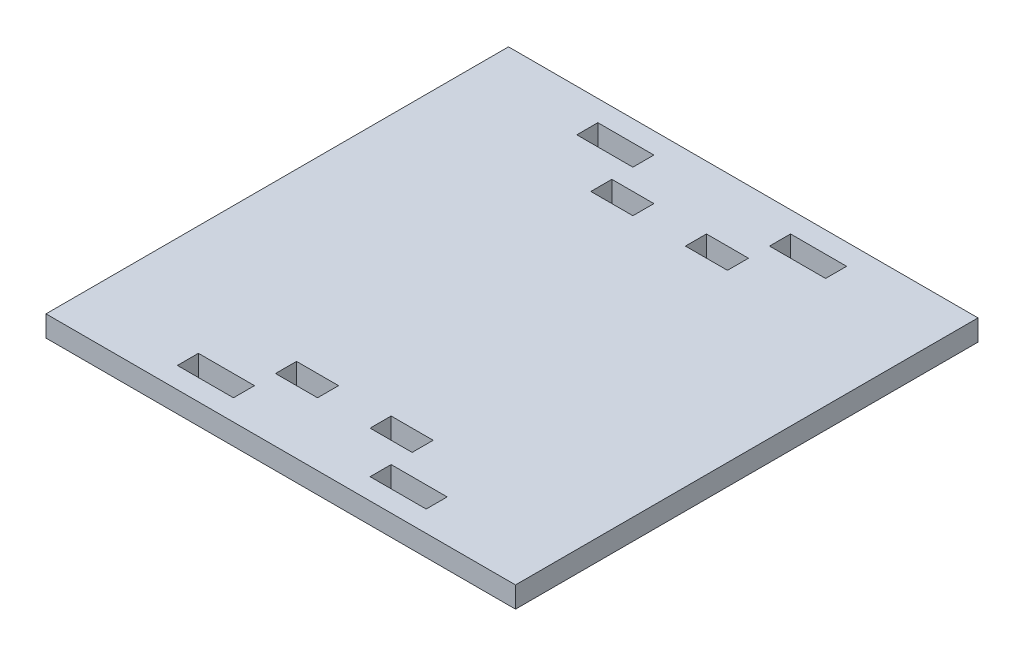
ISO-10303-21;
HEADER;
FILE_DESCRIPTION(('STEP AP214'),'2;1');
FILE_NAME('part.step','',(''),(''),'','','');
FILE_SCHEMA(('AUTOMOTIVE_DESIGN { 1 0 10303 214 1 1 1 1 }'));
ENDSEC;
DATA;
#1=APPLICATION_CONTEXT('core data for automotive mechanical design processes');
#2=APPLICATION_PROTOCOL_DEFINITION('international standard','automotive_design',2000,#1);
#3=PRODUCT_CONTEXT('',#1,'mechanical');
#4=PRODUCT('Part','Part','',(#3));
#5=PRODUCT_RELATED_PRODUCT_CATEGORY('part','',(#4));
#6=PRODUCT_DEFINITION_FORMATION('','',#4);
#7=PRODUCT_DEFINITION_CONTEXT('part definition',#1,'design');
#8=PRODUCT_DEFINITION('design','',#6,#7);
#9=PRODUCT_DEFINITION_SHAPE('','',#8);
#10=(LENGTH_UNIT() NAMED_UNIT(*) SI_UNIT(.MILLI.,.METRE.));
#11=(NAMED_UNIT(*) PLANE_ANGLE_UNIT() SI_UNIT($,.RADIAN.));
#12=(NAMED_UNIT(*) SI_UNIT($,.STERADIAN.) SOLID_ANGLE_UNIT());
#13=UNCERTAINTY_MEASURE_WITH_UNIT(LENGTH_MEASURE(1.E-05),#10,'distance_accuracy_value','');
#14=(GEOMETRIC_REPRESENTATION_CONTEXT(3) GLOBAL_UNCERTAINTY_ASSIGNED_CONTEXT((#13)) GLOBAL_UNIT_ASSIGNED_CONTEXT((#10,
#11,#12)) REPRESENTATION_CONTEXT('',''));
#15=CARTESIAN_POINT('',(0.,0.,0.));
#16=DIRECTION('',(0.,0.,1.));
#17=DIRECTION('',(1.,0.,0.));
#18=AXIS2_PLACEMENT_3D('',#15,#16,#17);
#19=CARTESIAN_POINT('',(0.,3.,-27.));
#20=DIRECTION('',(0.,0.,1.));
#21=DIRECTION('',(1.,0.,0.));
#22=AXIS2_PLACEMENT_3D('',#19,#20,#21);
#23=PLANE('',#22);
#24=DIRECTION('',(-1.,0.,0.));
#25=VECTOR('',#24,1.);
#26=CARTESIAN_POINT('',(0.,0.,-27.));
#27=LINE('',#26,#25);
#28=CARTESIAN_POINT('',(17.75,0.,-27.));
#29=VERTEX_POINT('',#28);
#30=CARTESIAN_POINT('',(9.75000000000001,0.,-27.));
#31=VERTEX_POINT('',#30);
#32=EDGE_CURVE('E386',#29,#31,#27,.T.);
#33=ORIENTED_EDGE('',*,*,#32,.T.);
#34=DIRECTION('',(0.,-1.,0.));
#35=VECTOR('',#34,1.);
#36=CARTESIAN_POINT('',(9.75000000000001,3.,-27.));
#37=LINE('',#36,#35);
#38=CARTESIAN_POINT('',(9.75000000000001,3.,-27.));
#39=VERTEX_POINT('',#38);
#40=EDGE_CURVE('E11',#39,#31,#37,.T.);
#41=ORIENTED_EDGE('',*,*,#40,.F.);
#42=DIRECTION('',(-1.,0.,0.));
#43=VECTOR('',#42,1.);
#44=CARTESIAN_POINT('',(0.,3.,-27.));
#45=LINE('',#44,#43);
#46=CARTESIAN_POINT('',(17.75,3.,-27.));
#47=VERTEX_POINT('',#46);
#48=EDGE_CURVE('E285',#47,#39,#45,.T.);
#49=ORIENTED_EDGE('',*,*,#48,.F.);
#50=DIRECTION('',(0.,-1.,0.));
#51=VECTOR('',#50,1.);
#52=CARTESIAN_POINT('',(17.75,3.,-27.));
#53=LINE('',#52,#51);
#54=EDGE_CURVE('E393',#47,#29,#53,.T.);
#55=ORIENTED_EDGE('',*,*,#54,.T.);
#56=EDGE_LOOP('',(#33,#41,#49,#55));
#57=FACE_BOUND('',#56,.T.);
#58=ADVANCED_FACE('F36',(#57),#23,.F.);
#59=CARTESIAN_POINT('',(9.75000000000001,3.,0.));
#60=DIRECTION('',(-1.,0.,0.));
#61=DIRECTION('',(0.,0.,1.));
#62=AXIS2_PLACEMENT_3D('',#59,#60,#61);
#63=PLANE('',#62);
#64=DIRECTION('',(0.,0.,-1.));
#65=VECTOR('',#64,1.);
#66=CARTESIAN_POINT('',(9.75000000000001,0.,0.));
#67=LINE('',#66,#65);
#68=CARTESIAN_POINT('',(9.75000000000001,0.,-30.));
#69=VERTEX_POINT('',#68);
#70=EDGE_CURVE('E290',#31,#69,#67,.T.);
#71=ORIENTED_EDGE('',*,*,#70,.T.);
#72=DIRECTION('',(0.,-1.,0.));
#73=VECTOR('',#72,1.);
#74=CARTESIAN_POINT('',(9.75000000000001,3.,-30.));
#75=LINE('',#74,#73);
#76=CARTESIAN_POINT('',(9.75000000000001,3.,-30.));
#77=VERTEX_POINT('',#76);
#78=EDGE_CURVE('E46',#77,#69,#75,.T.);
#79=ORIENTED_EDGE('',*,*,#78,.F.);
#80=DIRECTION('',(0.,0.,-1.));
#81=VECTOR('',#80,1.);
#82=CARTESIAN_POINT('',(9.75000000000001,3.,0.));
#83=LINE('',#82,#81);
#84=EDGE_CURVE('E279',#39,#77,#83,.T.);
#85=ORIENTED_EDGE('',*,*,#84,.F.);
#86=ORIENTED_EDGE('',*,*,#40,.T.);
#87=EDGE_LOOP('',(#71,#79,#85,#86));
#88=FACE_BOUND('',#87,.T.);
#89=ADVANCED_FACE('F289',(#88),#63,.F.);
#90=CARTESIAN_POINT('',(0.,3.,-30.));
#91=DIRECTION('',(0.,0.,-1.));
#92=DIRECTION('',(-1.,0.,0.));
#93=AXIS2_PLACEMENT_3D('',#90,#91,#92);
#94=PLANE('',#93);
#95=DIRECTION('',(1.,0.,0.));
#96=VECTOR('',#95,1.);
#97=CARTESIAN_POINT('',(0.,0.,-30.));
#98=LINE('',#97,#96);
#99=CARTESIAN_POINT('',(17.75,0.,-30.));
#100=VERTEX_POINT('',#99);
#101=EDGE_CURVE('E168',#69,#100,#98,.T.);
#102=ORIENTED_EDGE('',*,*,#101,.T.);
#103=DIRECTION('',(0.,-1.,0.));
#104=VECTOR('',#103,1.);
#105=CARTESIAN_POINT('',(17.75,3.,-30.));
#106=LINE('',#105,#104);
#107=CARTESIAN_POINT('',(17.75,3.,-30.));
#108=VERTEX_POINT('',#107);
#109=EDGE_CURVE('E291',#108,#100,#106,.T.);
#110=ORIENTED_EDGE('',*,*,#109,.F.);
#111=DIRECTION('',(1.,0.,0.));
#112=VECTOR('',#111,1.);
#113=CARTESIAN_POINT('',(0.,3.,-30.));
#114=LINE('',#113,#112);
#115=EDGE_CURVE('E283',#77,#108,#114,.T.);
#116=ORIENTED_EDGE('',*,*,#115,.F.);
#117=ORIENTED_EDGE('',*,*,#78,.T.);
#118=EDGE_LOOP('',(#102,#110,#116,#117));
#119=FACE_BOUND('',#118,.T.);
#120=ADVANCED_FACE('F293',(#119),#94,.F.);
#121=CARTESIAN_POINT('',(-9.75000000000001,3.,0.));
#122=DIRECTION('',(1.,0.,0.));
#123=DIRECTION('',(0.,0.,-1.));
#124=AXIS2_PLACEMENT_3D('',#121,#122,#123);
#125=PLANE('',#124);
#126=DIRECTION('',(0.,0.,1.));
#127=VECTOR('',#126,1.);
#128=CARTESIAN_POINT('',(-9.75000000000001,0.,0.));
#129=LINE('',#128,#127);
#130=CARTESIAN_POINT('',(-9.75000000000001,0.,27.));
#131=VERTEX_POINT('',#130);
#132=CARTESIAN_POINT('',(-9.75000000000001,0.,30.));
#133=VERTEX_POINT('',#132);
#134=EDGE_CURVE('E377',#131,#133,#129,.T.);
#135=ORIENTED_EDGE('',*,*,#134,.T.);
#136=DIRECTION('',(0.,-1.,0.));
#137=VECTOR('',#136,1.);
#138=CARTESIAN_POINT('',(-9.75000000000001,3.,30.));
#139=LINE('',#138,#137);
#140=CARTESIAN_POINT('',(-9.75000000000001,3.,30.));
#141=VERTEX_POINT('',#140);
#142=EDGE_CURVE('E395',#141,#133,#139,.T.);
#143=ORIENTED_EDGE('',*,*,#142,.F.);
#144=DIRECTION('',(0.,0.,1.));
#145=VECTOR('',#144,1.);
#146=CARTESIAN_POINT('',(-9.75000000000001,3.,0.));
#147=LINE('',#146,#145);
#148=CARTESIAN_POINT('',(-9.75000000000001,3.,27.));
#149=VERTEX_POINT('',#148);
#150=EDGE_CURVE('E558',#149,#141,#147,.T.);
#151=ORIENTED_EDGE('',*,*,#150,.F.);
#152=DIRECTION('',(0.,-1.,0.));
#153=VECTOR('',#152,1.);
#154=CARTESIAN_POINT('',(-9.75000000000001,3.,27.));
#155=LINE('',#154,#153);
#156=EDGE_CURVE('E397',#149,#131,#155,.T.);
#157=ORIENTED_EDGE('',*,*,#156,.T.);
#158=EDGE_LOOP('',(#135,#143,#151,#157));
#159=FACE_BOUND('',#158,.T.);
#160=ADVANCED_FACE('F578',(#159),#125,.F.);
#161=CARTESIAN_POINT('',(0.,3.,30.));
#162=DIRECTION('',(0.,0.,1.));
#163=DIRECTION('',(1.,0.,0.));
#164=AXIS2_PLACEMENT_3D('',#161,#162,#163);
#165=PLANE('',#164);
#166=DIRECTION('',(-1.,0.,0.));
#167=VECTOR('',#166,1.);
#168=CARTESIAN_POINT('',(0.,0.,30.));
#169=LINE('',#168,#167);
#170=CARTESIAN_POINT('',(-17.75,0.,30.));
#171=VERTEX_POINT('',#170);
#172=EDGE_CURVE('E380',#133,#171,#169,.T.);
#173=ORIENTED_EDGE('',*,*,#172,.T.);
#174=DIRECTION('',(0.,-1.,0.));
#175=VECTOR('',#174,1.);
#176=CARTESIAN_POINT('',(-17.75,3.,30.));
#177=LINE('',#176,#175);
#178=CARTESIAN_POINT('',(-17.75,3.,30.));
#179=VERTEX_POINT('',#178);
#180=EDGE_CURVE('E404',#179,#171,#177,.T.);
#181=ORIENTED_EDGE('',*,*,#180,.F.);
#182=DIRECTION('',(-1.,0.,0.));
#183=VECTOR('',#182,1.);
#184=CARTESIAN_POINT('',(0.,3.,30.));
#185=LINE('',#184,#183);
#186=EDGE_CURVE('E561',#141,#179,#185,.T.);
#187=ORIENTED_EDGE('',*,*,#186,.F.);
#188=ORIENTED_EDGE('',*,*,#142,.T.);
#189=EDGE_LOOP('',(#173,#181,#187,#188));
#190=FACE_BOUND('',#189,.T.);
#191=ADVANCED_FACE('F580',(#190),#165,.F.);
#192=CARTESIAN_POINT('',(-17.75,3.,0.));
#193=DIRECTION('',(-1.,0.,0.));
#194=DIRECTION('',(0.,0.,1.));
#195=AXIS2_PLACEMENT_3D('',#192,#193,#194);
#196=PLANE('',#195);
#197=DIRECTION('',(0.,0.,-1.));
#198=VECTOR('',#197,1.);
#199=CARTESIAN_POINT('',(-17.75,0.,0.));
#200=LINE('',#199,#198);
#201=CARTESIAN_POINT('',(-17.75,0.,27.));
#202=VERTEX_POINT('',#201);
#203=EDGE_CURVE('E382',#171,#202,#200,.T.);
#204=ORIENTED_EDGE('',*,*,#203,.T.);
#205=DIRECTION('',(0.,-1.,0.));
#206=VECTOR('',#205,1.);
#207=CARTESIAN_POINT('',(-17.75,3.,27.));
#208=LINE('',#207,#206);
#209=CARTESIAN_POINT('',(-17.75,3.,27.));
#210=VERTEX_POINT('',#209);
#211=EDGE_CURVE('E400',#210,#202,#208,.T.);
#212=ORIENTED_EDGE('',*,*,#211,.F.);
#213=DIRECTION('',(0.,0.,-1.));
#214=VECTOR('',#213,1.);
#215=CARTESIAN_POINT('',(-17.75,3.,0.));
#216=LINE('',#215,#214);
#217=EDGE_CURVE('E563',#179,#210,#216,.T.);
#218=ORIENTED_EDGE('',*,*,#217,.F.);
#219=ORIENTED_EDGE('',*,*,#180,.T.);
#220=EDGE_LOOP('',(#204,#212,#218,#219));
#221=FACE_BOUND('',#220,.T.);
#222=ADVANCED_FACE('F584',(#221),#196,.F.);
#223=CARTESIAN_POINT('',(3.75,3.,0.));
#224=DIRECTION('',(-1.,0.,0.));
#225=DIRECTION('',(0.,0.,1.));
#226=AXIS2_PLACEMENT_3D('',#223,#224,#225);
#227=PLANE('',#226);
#228=DIRECTION('',(0.,0.,-1.));
#229=VECTOR('',#228,1.);
#230=CARTESIAN_POINT('',(3.75,0.,0.));
#231=LINE('',#230,#229);
#232=CARTESIAN_POINT('',(3.75,0.,-21.));
#233=VERTEX_POINT('',#232);
#234=CARTESIAN_POINT('',(3.75,0.,-24.));
#235=VERTEX_POINT('',#234);
#236=EDGE_CURVE('E368',#233,#235,#231,.T.);
#237=ORIENTED_EDGE('',*,*,#236,.T.);
#238=DIRECTION('',(0.,-1.,0.));
#239=VECTOR('',#238,1.);
#240=CARTESIAN_POINT('',(3.75,3.,-24.));
#241=LINE('',#240,#239);
#242=CARTESIAN_POINT('',(3.75,3.,-24.));
#243=VERTEX_POINT('',#242);
#244=EDGE_CURVE('E401',#243,#235,#241,.T.);
#245=ORIENTED_EDGE('',*,*,#244,.F.);
#246=DIRECTION('',(0.,0.,-1.));
#247=VECTOR('',#246,1.);
#248=CARTESIAN_POINT('',(3.75,3.,0.));
#249=LINE('',#248,#247);
#250=CARTESIAN_POINT('',(3.75,3.,-21.));
#251=VERTEX_POINT('',#250);
#252=EDGE_CURVE('E549',#251,#243,#249,.T.);
#253=ORIENTED_EDGE('',*,*,#252,.F.);
#254=DIRECTION('',(0.,-1.,0.));
#255=VECTOR('',#254,1.);
#256=CARTESIAN_POINT('',(3.75,3.,-21.));
#257=LINE('',#256,#255);
#258=EDGE_CURVE('E409',#251,#233,#257,.T.);
#259=ORIENTED_EDGE('',*,*,#258,.T.);
#260=EDGE_LOOP('',(#237,#245,#253,#259));
#261=FACE_BOUND('',#260,.T.);
#262=ADVANCED_FACE('F614',(#261),#227,.F.);
#263=CARTESIAN_POINT('',(0.,3.,-24.));
#264=DIRECTION('',(0.,0.,-1.));
#265=DIRECTION('',(-1.,0.,0.));
#266=AXIS2_PLACEMENT_3D('',#263,#264,#265);
#267=PLANE('',#266);
#268=DIRECTION('',(1.,0.,0.));
#269=VECTOR('',#268,1.);
#270=CARTESIAN_POINT('',(0.,0.,-24.));
#271=LINE('',#270,#269);
#272=CARTESIAN_POINT('',(9.75000000000001,0.,-24.));
#273=VERTEX_POINT('',#272);
#274=EDGE_CURVE('E371',#235,#273,#271,.T.);
#275=ORIENTED_EDGE('',*,*,#274,.T.);
#276=DIRECTION('',(0.,-1.,0.));
#277=VECTOR('',#276,1.);
#278=CARTESIAN_POINT('',(9.75000000000001,3.,-24.));
#279=LINE('',#278,#277);
#280=CARTESIAN_POINT('',(9.75000000000001,3.,-24.));
#281=VERTEX_POINT('',#280);
#282=EDGE_CURVE('E416',#281,#273,#279,.T.);
#283=ORIENTED_EDGE('',*,*,#282,.F.);
#284=DIRECTION('',(1.,0.,0.));
#285=VECTOR('',#284,1.);
#286=CARTESIAN_POINT('',(0.,3.,-24.));
#287=LINE('',#286,#285);
#288=EDGE_CURVE('E552',#243,#281,#287,.T.);
#289=ORIENTED_EDGE('',*,*,#288,.F.);
#290=ORIENTED_EDGE('',*,*,#244,.T.);
#291=EDGE_LOOP('',(#275,#283,#289,#290));
#292=FACE_BOUND('',#291,.T.);
#293=ADVANCED_FACE('F627',(#292),#267,.F.);
#294=CARTESIAN_POINT('',(9.75000000000001,3.,0.));
#295=DIRECTION('',(1.,0.,0.));
#296=DIRECTION('',(0.,0.,-1.));
#297=AXIS2_PLACEMENT_3D('',#294,#295,#296);
#298=PLANE('',#297);
#299=DIRECTION('',(0.,0.,1.));
#300=VECTOR('',#299,1.);
#301=CARTESIAN_POINT('',(9.75000000000001,0.,0.));
#302=LINE('',#301,#300);
#303=CARTESIAN_POINT('',(9.75000000000001,0.,-21.));
#304=VERTEX_POINT('',#303);
#305=EDGE_CURVE('E373',#273,#304,#302,.T.);
#306=ORIENTED_EDGE('',*,*,#305,.T.);
#307=DIRECTION('',(0.,-1.,0.));
#308=VECTOR('',#307,1.);
#309=CARTESIAN_POINT('',(9.75000000000001,3.,-21.));
#310=LINE('',#309,#308);
#311=CARTESIAN_POINT('',(9.75000000000001,3.,-21.));
#312=VERTEX_POINT('',#311);
#313=EDGE_CURVE('E412',#312,#304,#310,.T.);
#314=ORIENTED_EDGE('',*,*,#313,.F.);
#315=DIRECTION('',(0.,0.,1.));
#316=VECTOR('',#315,1.);
#317=CARTESIAN_POINT('',(9.75000000000001,3.,0.));
#318=LINE('',#317,#316);
#319=EDGE_CURVE('E554',#281,#312,#318,.T.);
#320=ORIENTED_EDGE('',*,*,#319,.F.);
#321=ORIENTED_EDGE('',*,*,#282,.T.);
#322=EDGE_LOOP('',(#306,#314,#320,#321));
#323=FACE_BOUND('',#322,.T.);
#324=ADVANCED_FACE('F623',(#323),#298,.F.);
#325=CARTESIAN_POINT('',(-9.75000000000001,3.,0.));
#326=DIRECTION('',(-1.,0.,0.));
#327=DIRECTION('',(0.,0.,1.));
#328=AXIS2_PLACEMENT_3D('',#325,#326,#327);
#329=PLANE('',#328);
#330=DIRECTION('',(0.,0.,-1.));
#331=VECTOR('',#330,1.);
#332=CARTESIAN_POINT('',(-9.75000000000001,0.,0.));
#333=LINE('',#332,#331);
#334=CARTESIAN_POINT('',(-9.75000000000001,0.,-21.));
#335=VERTEX_POINT('',#334);
#336=CARTESIAN_POINT('',(-9.75000000000001,0.,-24.));
#337=VERTEX_POINT('',#336);
#338=EDGE_CURVE('E359',#335,#337,#333,.T.);
#339=ORIENTED_EDGE('',*,*,#338,.T.);
#340=DIRECTION('',(0.,-1.,0.));
#341=VECTOR('',#340,1.);
#342=CARTESIAN_POINT('',(-9.75000000000001,3.,-24.));
#343=LINE('',#342,#341);
#344=CARTESIAN_POINT('',(-9.75000000000001,3.,-24.));
#345=VERTEX_POINT('',#344);
#346=EDGE_CURVE('E413',#345,#337,#343,.T.);
#347=ORIENTED_EDGE('',*,*,#346,.F.);
#348=DIRECTION('',(0.,0.,-1.));
#349=VECTOR('',#348,1.);
#350=CARTESIAN_POINT('',(-9.75000000000001,3.,0.));
#351=LINE('',#350,#349);
#352=CARTESIAN_POINT('',(-9.75000000000001,3.,-21.));
#353=VERTEX_POINT('',#352);
#354=EDGE_CURVE('E540',#353,#345,#351,.T.);
#355=ORIENTED_EDGE('',*,*,#354,.F.);
#356=DIRECTION('',(0.,-1.,0.));
#357=VECTOR('',#356,1.);
#358=CARTESIAN_POINT('',(-9.75000000000001,3.,-21.));
#359=LINE('',#358,#357);
#360=EDGE_CURVE('E421',#353,#335,#359,.T.);
#361=ORIENTED_EDGE('',*,*,#360,.T.);
#362=EDGE_LOOP('',(#339,#347,#355,#361));
#363=FACE_BOUND('',#362,.T.);
#364=ADVANCED_FACE('F626',(#363),#329,.F.);
#365=CARTESIAN_POINT('',(0.,3.,-24.));
#366=DIRECTION('',(0.,0.,-1.));
#367=DIRECTION('',(-1.,0.,0.));
#368=AXIS2_PLACEMENT_3D('',#365,#366,#367);
#369=PLANE('',#368);
#370=DIRECTION('',(1.,0.,0.));
#371=VECTOR('',#370,1.);
#372=CARTESIAN_POINT('',(0.,0.,-24.));
#373=LINE('',#372,#371);
#374=CARTESIAN_POINT('',(-3.75,0.,-24.));
#375=VERTEX_POINT('',#374);
#376=EDGE_CURVE('E362',#337,#375,#373,.T.);
#377=ORIENTED_EDGE('',*,*,#376,.T.);
#378=DIRECTION('',(0.,-1.,0.));
#379=VECTOR('',#378,1.);
#380=CARTESIAN_POINT('',(-3.75,3.,-24.));
#381=LINE('',#380,#379);
#382=CARTESIAN_POINT('',(-3.75,3.,-24.));
#383=VERTEX_POINT('',#382);
#384=EDGE_CURVE('E428',#383,#375,#381,.T.);
#385=ORIENTED_EDGE('',*,*,#384,.F.);
#386=DIRECTION('',(1.,0.,0.));
#387=VECTOR('',#386,1.);
#388=CARTESIAN_POINT('',(0.,3.,-24.));
#389=LINE('',#388,#387);
#390=EDGE_CURVE('E543',#345,#383,#389,.T.);
#391=ORIENTED_EDGE('',*,*,#390,.F.);
#392=ORIENTED_EDGE('',*,*,#346,.T.);
#393=EDGE_LOOP('',(#377,#385,#391,#392));
#394=FACE_BOUND('',#393,.T.);
#395=ADVANCED_FACE('F643',(#394),#369,.F.);
#396=CARTESIAN_POINT('',(-3.75,3.,0.));
#397=DIRECTION('',(1.,0.,0.));
#398=DIRECTION('',(0.,0.,-1.));
#399=AXIS2_PLACEMENT_3D('',#396,#397,#398);
#400=PLANE('',#399);
#401=DIRECTION('',(0.,0.,1.));
#402=VECTOR('',#401,1.);
#403=CARTESIAN_POINT('',(-3.75,0.,0.));
#404=LINE('',#403,#402);
#405=CARTESIAN_POINT('',(-3.75,0.,-21.));
#406=VERTEX_POINT('',#405);
#407=EDGE_CURVE('E364',#375,#406,#404,.T.);
#408=ORIENTED_EDGE('',*,*,#407,.T.);
#409=DIRECTION('',(0.,-1.,0.));
#410=VECTOR('',#409,1.);
#411=CARTESIAN_POINT('',(-3.75,3.,-21.));
#412=LINE('',#411,#410);
#413=CARTESIAN_POINT('',(-3.75,3.,-21.));
#414=VERTEX_POINT('',#413);
#415=EDGE_CURVE('E424',#414,#406,#412,.T.);
#416=ORIENTED_EDGE('',*,*,#415,.F.);
#417=DIRECTION('',(0.,0.,1.));
#418=VECTOR('',#417,1.);
#419=CARTESIAN_POINT('',(-3.75,3.,0.));
#420=LINE('',#419,#418);
#421=EDGE_CURVE('E545',#383,#414,#420,.T.);
#422=ORIENTED_EDGE('',*,*,#421,.F.);
#423=ORIENTED_EDGE('',*,*,#384,.T.);
#424=EDGE_LOOP('',(#408,#416,#422,#423));
#425=FACE_BOUND('',#424,.T.);
#426=ADVANCED_FACE('F639',(#425),#400,.F.);
#427=CARTESIAN_POINT('',(9.75000000000001,3.,0.));
#428=DIRECTION('',(1.,0.,0.));
#429=DIRECTION('',(0.,0.,-1.));
#430=AXIS2_PLACEMENT_3D('',#427,#428,#429);
#431=PLANE('',#430);
#432=DIRECTION('',(0.,0.,1.));
#433=VECTOR('',#432,1.);
#434=CARTESIAN_POINT('',(9.75000000000001,0.,0.));
#435=LINE('',#434,#433);
#436=CARTESIAN_POINT('',(9.75000000000001,0.,27.));
#437=VERTEX_POINT('',#436);
#438=CARTESIAN_POINT('',(9.75000000000001,0.,30.));
#439=VERTEX_POINT('',#438);
#440=EDGE_CURVE('E347',#437,#439,#435,.T.);
#441=ORIENTED_EDGE('',*,*,#440,.F.);
#442=DIRECTION('',(0.,-1.,0.));
#443=VECTOR('',#442,1.);
#444=CARTESIAN_POINT('',(9.75000000000001,3.,27.));
#445=LINE('',#444,#443);
#446=CARTESIAN_POINT('',(9.75000000000001,3.,27.));
#447=VERTEX_POINT('',#446);
#448=EDGE_CURVE('E425',#447,#437,#445,.T.);
#449=ORIENTED_EDGE('',*,*,#448,.F.);
#450=DIRECTION('',(0.,0.,1.));
#451=VECTOR('',#450,1.);
#452=CARTESIAN_POINT('',(9.75000000000001,3.,0.));
#453=LINE('',#452,#451);
#454=CARTESIAN_POINT('',(9.75000000000001,3.,30.));
#455=VERTEX_POINT('',#454);
#456=EDGE_CURVE('E528',#447,#455,#453,.T.);
#457=ORIENTED_EDGE('',*,*,#456,.T.);
#458=DIRECTION('',(0.,-1.,0.));
#459=VECTOR('',#458,1.);
#460=CARTESIAN_POINT('',(9.75000000000001,3.,30.));
#461=LINE('',#460,#459);
#462=EDGE_CURVE('E433',#455,#439,#461,.T.);
#463=ORIENTED_EDGE('',*,*,#462,.T.);
#464=EDGE_LOOP('',(#441,#449,#457,#463));
#465=FACE_BOUND('',#464,.T.);
#466=ADVANCED_FACE('F642',(#465),#431,.T.);
#467=CARTESIAN_POINT('',(0.,3.,27.));
#468=DIRECTION('',(0.,0.,1.));
#469=DIRECTION('',(1.,0.,0.));
#470=AXIS2_PLACEMENT_3D('',#467,#468,#469);
#471=PLANE('',#470);
#472=DIRECTION('',(-1.,0.,0.));
#473=VECTOR('',#472,1.);
#474=CARTESIAN_POINT('',(0.,0.,27.));
#475=LINE('',#474,#473);
#476=CARTESIAN_POINT('',(17.75,0.,27.));
#477=VERTEX_POINT('',#476);
#478=EDGE_CURVE('E350',#477,#437,#475,.T.);
#479=ORIENTED_EDGE('',*,*,#478,.F.);
#480=DIRECTION('',(0.,-1.,0.));
#481=VECTOR('',#480,1.);
#482=CARTESIAN_POINT('',(17.75,3.,27.));
#483=LINE('',#482,#481);
#484=CARTESIAN_POINT('',(17.75,3.,27.));
#485=VERTEX_POINT('',#484);
#486=EDGE_CURVE('E438',#485,#477,#483,.T.);
#487=ORIENTED_EDGE('',*,*,#486,.F.);
#488=DIRECTION('',(-1.,0.,0.));
#489=VECTOR('',#488,1.);
#490=CARTESIAN_POINT('',(0.,3.,27.));
#491=LINE('',#490,#489);
#492=EDGE_CURVE('E531',#485,#447,#491,.T.);
#493=ORIENTED_EDGE('',*,*,#492,.T.);
#494=ORIENTED_EDGE('',*,*,#448,.T.);
#495=EDGE_LOOP('',(#479,#487,#493,#494));
#496=FACE_BOUND('',#495,.T.);
#497=ADVANCED_FACE('F659',(#496),#471,.T.);
#498=CARTESIAN_POINT('',(17.75,3.,0.));
#499=DIRECTION('',(-1.,0.,0.));
#500=DIRECTION('',(0.,0.,1.));
#501=AXIS2_PLACEMENT_3D('',#498,#499,#500);
#502=PLANE('',#501);
#503=DIRECTION('',(0.,0.,-1.));
#504=VECTOR('',#503,1.);
#505=CARTESIAN_POINT('',(17.75,0.,0.));
#506=LINE('',#505,#504);
#507=CARTESIAN_POINT('',(17.75,0.,30.));
#508=VERTEX_POINT('',#507);
#509=EDGE_CURVE('E353',#508,#477,#506,.T.);
#510=ORIENTED_EDGE('',*,*,#509,.F.);
#511=DIRECTION('',(0.,-1.,0.));
#512=VECTOR('',#511,1.);
#513=CARTESIAN_POINT('',(17.75,3.,30.));
#514=LINE('',#513,#512);
#515=CARTESIAN_POINT('',(17.75,3.,30.));
#516=VERTEX_POINT('',#515);
#517=EDGE_CURVE('E435',#516,#508,#514,.T.);
#518=ORIENTED_EDGE('',*,*,#517,.F.);
#519=DIRECTION('',(0.,0.,-1.));
#520=VECTOR('',#519,1.);
#521=CARTESIAN_POINT('',(17.75,3.,0.));
#522=LINE('',#521,#520);
#523=EDGE_CURVE('E534',#516,#485,#522,.T.);
#524=ORIENTED_EDGE('',*,*,#523,.T.);
#525=ORIENTED_EDGE('',*,*,#486,.T.);
#526=EDGE_LOOP('',(#510,#518,#524,#525));
#527=FACE_BOUND('',#526,.T.);
#528=ADVANCED_FACE('F655',(#527),#502,.T.);
#529=CARTESIAN_POINT('',(9.75000000000001,3.,0.));
#530=DIRECTION('',(-1.,0.,0.));
#531=DIRECTION('',(0.,0.,1.));
#532=AXIS2_PLACEMENT_3D('',#529,#530,#531);
#533=PLANE('',#532);
#534=DIRECTION('',(0.,0.,-1.));
#535=VECTOR('',#534,1.);
#536=CARTESIAN_POINT('',(9.75000000000001,0.,0.));
#537=LINE('',#536,#535);
#538=CARTESIAN_POINT('',(9.75000000000001,0.,24.));
#539=VERTEX_POINT('',#538);
#540=CARTESIAN_POINT('',(9.75000000000001,0.,21.));
#541=VERTEX_POINT('',#540);
#542=EDGE_CURVE('E335',#539,#541,#537,.T.);
#543=ORIENTED_EDGE('',*,*,#542,.F.);
#544=DIRECTION('',(0.,-1.,0.));
#545=VECTOR('',#544,1.);
#546=CARTESIAN_POINT('',(9.75000000000001,3.,24.));
#547=LINE('',#546,#545);
#548=CARTESIAN_POINT('',(9.75000000000001,3.,24.));
#549=VERTEX_POINT('',#548);
#550=EDGE_CURVE('E436',#549,#539,#547,.T.);
#551=ORIENTED_EDGE('',*,*,#550,.F.);
#552=DIRECTION('',(0.,0.,-1.));
#553=VECTOR('',#552,1.);
#554=CARTESIAN_POINT('',(9.75000000000001,3.,0.));
#555=LINE('',#554,#553);
#556=CARTESIAN_POINT('',(9.75000000000001,3.,21.));
#557=VERTEX_POINT('',#556);
#558=EDGE_CURVE('E516',#549,#557,#555,.T.);
#559=ORIENTED_EDGE('',*,*,#558,.T.);
#560=DIRECTION('',(0.,-1.,0.));
#561=VECTOR('',#560,1.);
#562=CARTESIAN_POINT('',(9.75000000000001,3.,21.));
#563=LINE('',#562,#561);
#564=EDGE_CURVE('E441',#557,#541,#563,.T.);
#565=ORIENTED_EDGE('',*,*,#564,.T.);
#566=EDGE_LOOP('',(#543,#551,#559,#565));
#567=FACE_BOUND('',#566,.T.);
#568=ADVANCED_FACE('F658',(#567),#533,.T.);
#569=CARTESIAN_POINT('',(0.,3.,24.));
#570=DIRECTION('',(0.,0.,-1.));
#571=DIRECTION('',(-1.,0.,0.));
#572=AXIS2_PLACEMENT_3D('',#569,#570,#571);
#573=PLANE('',#572);
#574=DIRECTION('',(1.,0.,0.));
#575=VECTOR('',#574,1.);
#576=CARTESIAN_POINT('',(0.,0.,24.));
#577=LINE('',#576,#575);
#578=CARTESIAN_POINT('',(3.75,0.,24.));
#579=VERTEX_POINT('',#578);
#580=EDGE_CURVE('E338',#579,#539,#577,.T.);
#581=ORIENTED_EDGE('',*,*,#580,.F.);
#582=DIRECTION('',(0.,-1.,0.));
#583=VECTOR('',#582,1.);
#584=CARTESIAN_POINT('',(3.75,3.,24.));
#585=LINE('',#584,#583);
#586=CARTESIAN_POINT('',(3.75,3.,24.));
#587=VERTEX_POINT('',#586);
#588=EDGE_CURVE('E446',#587,#579,#585,.T.);
#589=ORIENTED_EDGE('',*,*,#588,.F.);
#590=DIRECTION('',(1.,0.,0.));
#591=VECTOR('',#590,1.);
#592=CARTESIAN_POINT('',(0.,3.,24.));
#593=LINE('',#592,#591);
#594=EDGE_CURVE('E519',#587,#549,#593,.T.);
#595=ORIENTED_EDGE('',*,*,#594,.T.);
#596=ORIENTED_EDGE('',*,*,#550,.T.);
#597=EDGE_LOOP('',(#581,#589,#595,#596));
#598=FACE_BOUND('',#597,.T.);
#599=ADVANCED_FACE('F675',(#598),#573,.T.);
#600=CARTESIAN_POINT('',(3.75,3.,0.));
#601=DIRECTION('',(1.,0.,0.));
#602=DIRECTION('',(0.,0.,-1.));
#603=AXIS2_PLACEMENT_3D('',#600,#601,#602);
#604=PLANE('',#603);
#605=DIRECTION('',(0.,0.,1.));
#606=VECTOR('',#605,1.);
#607=CARTESIAN_POINT('',(3.75,0.,0.));
#608=LINE('',#607,#606);
#609=CARTESIAN_POINT('',(3.75,0.,21.));
#610=VERTEX_POINT('',#609);
#611=EDGE_CURVE('E341',#610,#579,#608,.T.);
#612=ORIENTED_EDGE('',*,*,#611,.F.);
#613=DIRECTION('',(0.,-1.,0.));
#614=VECTOR('',#613,1.);
#615=CARTESIAN_POINT('',(3.75,3.,21.));
#616=LINE('',#615,#614);
#617=CARTESIAN_POINT('',(3.75,3.,21.));
#618=VERTEX_POINT('',#617);
#619=EDGE_CURVE('E443',#618,#610,#616,.T.);
#620=ORIENTED_EDGE('',*,*,#619,.F.);
#621=DIRECTION('',(0.,0.,1.));
#622=VECTOR('',#621,1.);
#623=CARTESIAN_POINT('',(3.75,3.,0.));
#624=LINE('',#623,#622);
#625=EDGE_CURVE('E522',#618,#587,#624,.T.);
#626=ORIENTED_EDGE('',*,*,#625,.T.);
#627=ORIENTED_EDGE('',*,*,#588,.T.);
#628=EDGE_LOOP('',(#612,#620,#626,#627));
#629=FACE_BOUND('',#628,.T.);
#630=ADVANCED_FACE('F671',(#629),#604,.T.);
#631=CARTESIAN_POINT('',(-9.75000000000001,3.,0.));
#632=DIRECTION('',(-1.,0.,0.));
#633=DIRECTION('',(0.,0.,1.));
#634=AXIS2_PLACEMENT_3D('',#631,#632,#633);
#635=PLANE('',#634);
#636=DIRECTION('',(0.,0.,-1.));
#637=VECTOR('',#636,1.);
#638=CARTESIAN_POINT('',(-9.75000000000001,0.,0.));
#639=LINE('',#638,#637);
#640=CARTESIAN_POINT('',(-9.75000000000001,0.,-27.));
#641=VERTEX_POINT('',#640);
#642=CARTESIAN_POINT('',(-9.75000000000001,0.,-30.));
#643=VERTEX_POINT('',#642);
#644=EDGE_CURVE('E323',#641,#643,#639,.T.);
#645=ORIENTED_EDGE('',*,*,#644,.F.);
#646=DIRECTION('',(0.,-1.,0.));
#647=VECTOR('',#646,1.);
#648=CARTESIAN_POINT('',(-9.75000000000001,3.,-27.));
#649=LINE('',#648,#647);
#650=CARTESIAN_POINT('',(-9.75000000000001,3.,-27.));
#651=VERTEX_POINT('',#650);
#652=EDGE_CURVE('E444',#651,#641,#649,.T.);
#653=ORIENTED_EDGE('',*,*,#652,.F.);
#654=DIRECTION('',(0.,0.,-1.));
#655=VECTOR('',#654,1.);
#656=CARTESIAN_POINT('',(-9.75000000000001,3.,0.));
#657=LINE('',#656,#655);
#658=CARTESIAN_POINT('',(-9.75000000000001,3.,-30.));
#659=VERTEX_POINT('',#658);
#660=EDGE_CURVE('E505',#651,#659,#657,.T.);
#661=ORIENTED_EDGE('',*,*,#660,.T.);
#662=DIRECTION('',(0.,-1.,0.));
#663=VECTOR('',#662,1.);
#664=CARTESIAN_POINT('',(-9.75000000000001,3.,-30.));
#665=LINE('',#664,#663);
#666=EDGE_CURVE('E449',#659,#643,#665,.T.);
#667=ORIENTED_EDGE('',*,*,#666,.T.);
#668=EDGE_LOOP('',(#645,#653,#661,#667));
#669=FACE_BOUND('',#668,.T.);
#670=ADVANCED_FACE('F674',(#669),#635,.T.);
#671=CARTESIAN_POINT('',(0.,3.,-27.));
#672=DIRECTION('',(0.,0.,1.));
#673=DIRECTION('',(1.,0.,0.));
#674=AXIS2_PLACEMENT_3D('',#671,#672,#673);
#675=PLANE('',#674);
#676=DIRECTION('',(-1.,0.,0.));
#677=VECTOR('',#676,1.);
#678=CARTESIAN_POINT('',(0.,0.,-27.));
#679=LINE('',#678,#677);
#680=CARTESIAN_POINT('',(-17.75,0.,-27.));
#681=VERTEX_POINT('',#680);
#682=EDGE_CURVE('E326',#641,#681,#679,.T.);
#683=ORIENTED_EDGE('',*,*,#682,.T.);
#684=DIRECTION('',(0.,-1.,0.));
#685=VECTOR('',#684,1.);
#686=CARTESIAN_POINT('',(-17.75,3.,-27.));
#687=LINE('',#686,#685);
#688=CARTESIAN_POINT('',(-17.75,3.,-27.));
#689=VERTEX_POINT('',#688);
#690=EDGE_CURVE('E454',#689,#681,#687,.T.);
#691=ORIENTED_EDGE('',*,*,#690,.F.);
#692=DIRECTION('',(-1.,0.,0.));
#693=VECTOR('',#692,1.);
#694=CARTESIAN_POINT('',(0.,3.,-27.));
#695=LINE('',#694,#693);
#696=EDGE_CURVE('E508',#651,#689,#695,.T.);
#697=ORIENTED_EDGE('',*,*,#696,.F.);
#698=ORIENTED_EDGE('',*,*,#652,.T.);
#699=EDGE_LOOP('',(#683,#691,#697,#698));
#700=FACE_BOUND('',#699,.T.);
#701=ADVANCED_FACE('F690',(#700),#675,.F.);
#702=CARTESIAN_POINT('',(-17.75,3.,0.));
#703=DIRECTION('',(1.,0.,0.));
#704=DIRECTION('',(0.,0.,-1.));
#705=AXIS2_PLACEMENT_3D('',#702,#703,#704);
#706=PLANE('',#705);
#707=DIRECTION('',(0.,0.,1.));
#708=VECTOR('',#707,1.);
#709=CARTESIAN_POINT('',(-17.75,0.,0.));
#710=LINE('',#709,#708);
#711=CARTESIAN_POINT('',(-17.75,0.,-30.));
#712=VERTEX_POINT('',#711);
#713=EDGE_CURVE('E329',#712,#681,#710,.T.);
#714=ORIENTED_EDGE('',*,*,#713,.F.);
#715=DIRECTION('',(0.,-1.,0.));
#716=VECTOR('',#715,1.);
#717=CARTESIAN_POINT('',(-17.75,3.,-30.));
#718=LINE('',#717,#716);
#719=CARTESIAN_POINT('',(-17.75,3.,-30.));
#720=VERTEX_POINT('',#719);
#721=EDGE_CURVE('E451',#720,#712,#718,.T.);
#722=ORIENTED_EDGE('',*,*,#721,.F.);
#723=DIRECTION('',(0.,0.,1.));
#724=VECTOR('',#723,1.);
#725=CARTESIAN_POINT('',(-17.75,3.,0.));
#726=LINE('',#725,#724);
#727=EDGE_CURVE('E510',#720,#689,#726,.T.);
#728=ORIENTED_EDGE('',*,*,#727,.T.);
#729=ORIENTED_EDGE('',*,*,#690,.T.);
#730=EDGE_LOOP('',(#714,#722,#728,#729));
#731=FACE_BOUND('',#730,.T.);
#732=ADVANCED_FACE('F686',(#731),#706,.T.);
#733=CARTESIAN_POINT('',(-3.75,3.,0.));
#734=DIRECTION('',(-1.,0.,0.));
#735=DIRECTION('',(0.,0.,1.));
#736=AXIS2_PLACEMENT_3D('',#733,#734,#735);
#737=PLANE('',#736);
#738=DIRECTION('',(0.,0.,-1.));
#739=VECTOR('',#738,1.);
#740=CARTESIAN_POINT('',(-3.75,0.,0.));
#741=LINE('',#740,#739);
#742=CARTESIAN_POINT('',(-3.75,0.,24.));
#743=VERTEX_POINT('',#742);
#744=CARTESIAN_POINT('',(-3.75,0.,21.));
#745=VERTEX_POINT('',#744);
#746=EDGE_CURVE('E311',#743,#745,#741,.T.);
#747=ORIENTED_EDGE('',*,*,#746,.F.);
#748=DIRECTION('',(0.,-1.,0.));
#749=VECTOR('',#748,1.);
#750=CARTESIAN_POINT('',(-3.75,3.,24.));
#751=LINE('',#750,#749);
#752=CARTESIAN_POINT('',(-3.75,3.,24.));
#753=VERTEX_POINT('',#752);
#754=EDGE_CURVE('E452',#753,#743,#751,.T.);
#755=ORIENTED_EDGE('',*,*,#754,.F.);
#756=DIRECTION('',(0.,0.,-1.));
#757=VECTOR('',#756,1.);
#758=CARTESIAN_POINT('',(-3.75,3.,0.));
#759=LINE('',#758,#757);
#760=CARTESIAN_POINT('',(-3.75,3.,21.));
#761=VERTEX_POINT('',#760);
#762=EDGE_CURVE('E489',#753,#761,#759,.T.);
#763=ORIENTED_EDGE('',*,*,#762,.T.);
#764=DIRECTION('',(0.,-1.,0.));
#765=VECTOR('',#764,1.);
#766=CARTESIAN_POINT('',(-3.75,3.,21.));
#767=LINE('',#766,#765);
#768=EDGE_CURVE('E457',#761,#745,#767,.T.);
#769=ORIENTED_EDGE('',*,*,#768,.T.);
#770=EDGE_LOOP('',(#747,#755,#763,#769));
#771=FACE_BOUND('',#770,.T.);
#772=ADVANCED_FACE('F689',(#771),#737,.T.);
#773=CARTESIAN_POINT('',(0.,3.,24.));
#774=DIRECTION('',(0.,0.,-1.));
#775=DIRECTION('',(-1.,0.,0.));
#776=AXIS2_PLACEMENT_3D('',#773,#774,#775);
#777=PLANE('',#776);
#778=DIRECTION('',(1.,0.,0.));
#779=VECTOR('',#778,1.);
#780=CARTESIAN_POINT('',(0.,0.,24.));
#781=LINE('',#780,#779);
#782=CARTESIAN_POINT('',(-9.75000000000001,0.,24.));
#783=VERTEX_POINT('',#782);
#784=EDGE_CURVE('E314',#783,#743,#781,.T.);
#785=ORIENTED_EDGE('',*,*,#784,.F.);
#786=DIRECTION('',(0.,-1.,0.));
#787=VECTOR('',#786,1.);
#788=CARTESIAN_POINT('',(-9.75000000000001,3.,24.));
#789=LINE('',#788,#787);
#790=CARTESIAN_POINT('',(-9.75000000000001,3.,24.));
#791=VERTEX_POINT('',#790);
#792=EDGE_CURVE('E461',#791,#783,#789,.T.);
#793=ORIENTED_EDGE('',*,*,#792,.F.);
#794=DIRECTION('',(1.,0.,0.));
#795=VECTOR('',#794,1.);
#796=CARTESIAN_POINT('',(0.,3.,24.));
#797=LINE('',#796,#795);
#798=EDGE_CURVE('E492',#791,#753,#797,.T.);
#799=ORIENTED_EDGE('',*,*,#798,.T.);
#800=ORIENTED_EDGE('',*,*,#754,.T.);
#801=EDGE_LOOP('',(#785,#793,#799,#800));
#802=FACE_BOUND('',#801,.T.);
#803=ADVANCED_FACE('F704',(#802),#777,.T.);
#804=CARTESIAN_POINT('',(-9.75000000000001,3.,0.));
#805=DIRECTION('',(1.,0.,0.));
#806=DIRECTION('',(0.,0.,-1.));
#807=AXIS2_PLACEMENT_3D('',#804,#805,#806);
#808=PLANE('',#807);
#809=DIRECTION('',(0.,0.,1.));
#810=VECTOR('',#809,1.);
#811=CARTESIAN_POINT('',(-9.75000000000001,0.,0.));
#812=LINE('',#811,#810);
#813=CARTESIAN_POINT('',(-9.75000000000001,0.,21.));
#814=VERTEX_POINT('',#813);
#815=EDGE_CURVE('E317',#814,#783,#812,.T.);
#816=ORIENTED_EDGE('',*,*,#815,.F.);
#817=DIRECTION('',(0.,-1.,0.));
#818=VECTOR('',#817,1.);
#819=CARTESIAN_POINT('',(-9.75000000000001,3.,21.));
#820=LINE('',#819,#818);
#821=CARTESIAN_POINT('',(-9.75000000000001,3.,21.));
#822=VERTEX_POINT('',#821);
#823=EDGE_CURVE('E459',#822,#814,#820,.T.);
#824=ORIENTED_EDGE('',*,*,#823,.F.);
#825=DIRECTION('',(0.,0.,1.));
#826=VECTOR('',#825,1.);
#827=CARTESIAN_POINT('',(-9.75000000000001,3.,0.));
#828=LINE('',#827,#826);
#829=EDGE_CURVE('E499',#822,#791,#828,.T.);
#830=ORIENTED_EDGE('',*,*,#829,.T.);
#831=ORIENTED_EDGE('',*,*,#792,.T.);
#832=EDGE_LOOP('',(#816,#824,#830,#831));
#833=FACE_BOUND('',#832,.T.);
#834=ADVANCED_FACE('F701',(#833),#808,.T.);
#835=CARTESIAN_POINT('',(33.5000000000004,3.,4.64905891561783E-13));
#836=DIRECTION('',(1.,0.,0.));
#837=DIRECTION('',(0.,0.,-1.));
#838=AXIS2_PLACEMENT_3D('',#835,#836,#837);
#839=PLANE('',#838);
#840=DIRECTION('',(0.,0.,1.));
#841=VECTOR('',#840,1.);
#842=CARTESIAN_POINT('',(33.5000000000004,0.,4.64905891561783E-13));
#843=LINE('',#842,#841);
#844=CARTESIAN_POINT('',(33.5,0.,-33.));
#845=VERTEX_POINT('',#844);
#846=CARTESIAN_POINT('',(33.5,0.,33.));
#847=VERTEX_POINT('',#846);
#848=EDGE_CURVE('E299',#845,#847,#843,.T.);
#849=ORIENTED_EDGE('',*,*,#848,.F.);
#850=DIRECTION('',(0.,-1.,0.));
#851=VECTOR('',#850,1.);
#852=CARTESIAN_POINT('',(33.5,3.,-33.));
#853=LINE('',#852,#851);
#854=CARTESIAN_POINT('',(33.5,3.,-33.));
#855=VERTEX_POINT('',#854);
#856=EDGE_CURVE('E40',#855,#845,#853,.T.);
#857=ORIENTED_EDGE('',*,*,#856,.F.);
#858=DIRECTION('',(0.,0.,1.));
#859=VECTOR('',#858,1.);
#860=CARTESIAN_POINT('',(33.5000000000004,3.,4.64905891561783E-13));
#861=LINE('',#860,#859);
#862=CARTESIAN_POINT('',(33.5,3.,33.));
#863=VERTEX_POINT('',#862);
#864=EDGE_CURVE('E392',#855,#863,#861,.T.);
#865=ORIENTED_EDGE('',*,*,#864,.T.);
#866=DIRECTION('',(0.,-1.,0.));
#867=VECTOR('',#866,1.);
#868=CARTESIAN_POINT('',(33.5,3.,33.));
#869=LINE('',#868,#867);
#870=EDGE_CURVE('E295',#863,#847,#869,.T.);
#871=ORIENTED_EDGE('',*,*,#870,.T.);
#872=EDGE_LOOP('',(#849,#857,#865,#871));
#873=FACE_BOUND('',#872,.T.);
#874=ADVANCED_FACE('F38',(#873),#839,.T.);
#875=CARTESIAN_POINT('',(0.,3.,-33.));
#876=DIRECTION('',(0.,0.,-1.));
#877=DIRECTION('',(-1.,0.,0.));
#878=AXIS2_PLACEMENT_3D('',#875,#876,#877);
#879=PLANE('',#878);
#880=DIRECTION('',(1.,0.,0.));
#881=VECTOR('',#880,1.);
#882=CARTESIAN_POINT('',(0.,0.,-33.));
#883=LINE('',#882,#881);
#884=CARTESIAN_POINT('',(-33.5,0.,-33.));
#885=VERTEX_POINT('',#884);
#886=EDGE_CURVE('E302',#885,#845,#883,.T.);
#887=ORIENTED_EDGE('',*,*,#886,.F.);
#888=DIRECTION('',(0.,-1.,0.));
#889=VECTOR('',#888,1.);
#890=CARTESIAN_POINT('',(-33.5,3.,-33.));
#891=LINE('',#890,#889);
#892=CARTESIAN_POINT('',(-33.5,3.,-33.));
#893=VERTEX_POINT('',#892);
#894=EDGE_CURVE('E466',#893,#885,#891,.T.);
#895=ORIENTED_EDGE('',*,*,#894,.F.);
#896=DIRECTION('',(1.,0.,0.));
#897=VECTOR('',#896,1.);
#898=CARTESIAN_POINT('',(0.,3.,-33.));
#899=LINE('',#898,#897);
#900=EDGE_CURVE('E475',#893,#855,#899,.T.);
#901=ORIENTED_EDGE('',*,*,#900,.T.);
#902=ORIENTED_EDGE('',*,*,#856,.T.);
#903=EDGE_LOOP('',(#887,#895,#901,#902));
#904=FACE_BOUND('',#903,.T.);
#905=ADVANCED_FACE('F473',(#904),#879,.T.);
#906=CARTESIAN_POINT('',(-33.5,3.,0.));
#907=DIRECTION('',(1.,0.,0.));
#908=DIRECTION('',(0.,0.,-1.));
#909=AXIS2_PLACEMENT_3D('',#906,#907,#908);
#910=PLANE('',#909);
#911=DIRECTION('',(0.,0.,1.));
#912=VECTOR('',#911,1.);
#913=CARTESIAN_POINT('',(-33.5,0.,0.));
#914=LINE('',#913,#912);
#915=CARTESIAN_POINT('',(-33.5,0.,33.));
#916=VERTEX_POINT('',#915);
#917=EDGE_CURVE('E305',#885,#916,#914,.T.);
#918=ORIENTED_EDGE('',*,*,#917,.T.);
#919=DIRECTION('',(0.,-1.,0.));
#920=VECTOR('',#919,1.);
#921=CARTESIAN_POINT('',(-33.5,3.,33.));
#922=LINE('',#921,#920);
#923=CARTESIAN_POINT('',(-33.5,3.,33.));
#924=VERTEX_POINT('',#923);
#925=EDGE_CURVE('E465',#924,#916,#922,.T.);
#926=ORIENTED_EDGE('',*,*,#925,.F.);
#927=DIRECTION('',(0.,0.,1.));
#928=VECTOR('',#927,1.);
#929=CARTESIAN_POINT('',(-33.5,3.,0.));
#930=LINE('',#929,#928);
#931=EDGE_CURVE('E483',#893,#924,#930,.T.);
#932=ORIENTED_EDGE('',*,*,#931,.F.);
#933=ORIENTED_EDGE('',*,*,#894,.T.);
#934=EDGE_LOOP('',(#918,#926,#932,#933));
#935=FACE_BOUND('',#934,.T.);
#936=ADVANCED_FACE('F481',(#935),#910,.F.);
#937=CARTESIAN_POINT('',(0.,3.,27.));
#938=DIRECTION('',(0.,0.,-1.));
#939=DIRECTION('',(-1.,0.,0.));
#940=AXIS2_PLACEMENT_3D('',#937,#938,#939);
#941=PLANE('',#940);
#942=DIRECTION('',(1.,0.,0.));
#943=VECTOR('',#942,1.);
#944=CARTESIAN_POINT('',(0.,0.,27.));
#945=LINE('',#944,#943);
#946=EDGE_CURVE('E384',#202,#131,#945,.T.);
#947=ORIENTED_EDGE('',*,*,#946,.T.);
#948=ORIENTED_EDGE('',*,*,#156,.F.);
#949=DIRECTION('',(1.,0.,0.));
#950=VECTOR('',#949,1.);
#951=CARTESIAN_POINT('',(0.,3.,27.));
#952=LINE('',#951,#950);
#953=EDGE_CURVE('E565',#210,#149,#952,.T.);
#954=ORIENTED_EDGE('',*,*,#953,.F.);
#955=ORIENTED_EDGE('',*,*,#211,.T.);
#956=EDGE_LOOP('',(#947,#948,#954,#955));
#957=FACE_BOUND('',#956,.T.);
#958=ADVANCED_FACE('F574',(#957),#941,.F.);
#959=CARTESIAN_POINT('',(0.,3.,-21.));
#960=DIRECTION('',(0.,0.,1.));
#961=DIRECTION('',(1.,0.,0.));
#962=AXIS2_PLACEMENT_3D('',#959,#960,#961);
#963=PLANE('',#962);
#964=DIRECTION('',(-1.,0.,0.));
#965=VECTOR('',#964,1.);
#966=CARTESIAN_POINT('',(0.,0.,-21.));
#967=LINE('',#966,#965);
#968=EDGE_CURVE('E375',#304,#233,#967,.T.);
#969=ORIENTED_EDGE('',*,*,#968,.T.);
#970=ORIENTED_EDGE('',*,*,#258,.F.);
#971=DIRECTION('',(-1.,0.,0.));
#972=VECTOR('',#971,1.);
#973=CARTESIAN_POINT('',(0.,3.,-21.));
#974=LINE('',#973,#972);
#975=EDGE_CURVE('E556',#312,#251,#974,.T.);
#976=ORIENTED_EDGE('',*,*,#975,.F.);
#977=ORIENTED_EDGE('',*,*,#313,.T.);
#978=EDGE_LOOP('',(#969,#970,#976,#977));
#979=FACE_BOUND('',#978,.T.);
#980=ADVANCED_FACE('F611',(#979),#963,.F.);
#981=CARTESIAN_POINT('',(0.,3.,-21.));
#982=DIRECTION('',(0.,0.,1.));
#983=DIRECTION('',(1.,0.,0.));
#984=AXIS2_PLACEMENT_3D('',#981,#982,#983);
#985=PLANE('',#984);
#986=DIRECTION('',(-1.,0.,0.));
#987=VECTOR('',#986,1.);
#988=CARTESIAN_POINT('',(0.,0.,-21.));
#989=LINE('',#988,#987);
#990=EDGE_CURVE('E366',#406,#335,#989,.T.);
#991=ORIENTED_EDGE('',*,*,#990,.T.);
#992=ORIENTED_EDGE('',*,*,#360,.F.);
#993=DIRECTION('',(-1.,0.,0.));
#994=VECTOR('',#993,1.);
#995=CARTESIAN_POINT('',(0.,3.,-21.));
#996=LINE('',#995,#994);
#997=EDGE_CURVE('E547',#414,#353,#996,.T.);
#998=ORIENTED_EDGE('',*,*,#997,.F.);
#999=ORIENTED_EDGE('',*,*,#415,.T.);
#1000=EDGE_LOOP('',(#991,#992,#998,#999));
#1001=FACE_BOUND('',#1000,.T.);
#1002=ADVANCED_FACE('F621',(#1001),#985,.F.);
#1003=CARTESIAN_POINT('',(0.,3.,30.));
#1004=DIRECTION('',(0.,0.,-1.));
#1005=DIRECTION('',(-1.,0.,0.));
#1006=AXIS2_PLACEMENT_3D('',#1003,#1004,#1005);
#1007=PLANE('',#1006);
#1008=DIRECTION('',(1.,0.,0.));
#1009=VECTOR('',#1008,1.);
#1010=CARTESIAN_POINT('',(0.,0.,30.));
#1011=LINE('',#1010,#1009);
#1012=EDGE_CURVE('E356',#439,#508,#1011,.T.);
#1013=ORIENTED_EDGE('',*,*,#1012,.F.);
#1014=ORIENTED_EDGE('',*,*,#462,.F.);
#1015=DIRECTION('',(1.,0.,0.));
#1016=VECTOR('',#1015,1.);
#1017=CARTESIAN_POINT('',(0.,3.,30.));
#1018=LINE('',#1017,#1016);
#1019=EDGE_CURVE('E537',#455,#516,#1018,.T.);
#1020=ORIENTED_EDGE('',*,*,#1019,.T.);
#1021=ORIENTED_EDGE('',*,*,#517,.T.);
#1022=EDGE_LOOP('',(#1013,#1014,#1020,#1021));
#1023=FACE_BOUND('',#1022,.T.);
#1024=ADVANCED_FACE('F637',(#1023),#1007,.T.);
#1025=CARTESIAN_POINT('',(0.,3.,21.));
#1026=DIRECTION('',(0.,0.,1.));
#1027=DIRECTION('',(1.,0.,0.));
#1028=AXIS2_PLACEMENT_3D('',#1025,#1026,#1027);
#1029=PLANE('',#1028);
#1030=DIRECTION('',(-1.,0.,0.));
#1031=VECTOR('',#1030,1.);
#1032=CARTESIAN_POINT('',(0.,0.,21.));
#1033=LINE('',#1032,#1031);
#1034=EDGE_CURVE('E344',#541,#610,#1033,.T.);
#1035=ORIENTED_EDGE('',*,*,#1034,.F.);
#1036=ORIENTED_EDGE('',*,*,#564,.F.);
#1037=DIRECTION('',(-1.,0.,0.));
#1038=VECTOR('',#1037,1.);
#1039=CARTESIAN_POINT('',(0.,3.,21.));
#1040=LINE('',#1039,#1038);
#1041=EDGE_CURVE('E525',#557,#618,#1040,.T.);
#1042=ORIENTED_EDGE('',*,*,#1041,.T.);
#1043=ORIENTED_EDGE('',*,*,#619,.T.);
#1044=EDGE_LOOP('',(#1035,#1036,#1042,#1043));
#1045=FACE_BOUND('',#1044,.T.);
#1046=ADVANCED_FACE('F653',(#1045),#1029,.T.);
#1047=CARTESIAN_POINT('',(0.,3.,-30.));
#1048=DIRECTION('',(0.,0.,1.));
#1049=DIRECTION('',(1.,0.,0.));
#1050=AXIS2_PLACEMENT_3D('',#1047,#1048,#1049);
#1051=PLANE('',#1050);
#1052=DIRECTION('',(-1.,0.,0.));
#1053=VECTOR('',#1052,1.);
#1054=CARTESIAN_POINT('',(0.,0.,-30.));
#1055=LINE('',#1054,#1053);
#1056=EDGE_CURVE('E332',#643,#712,#1055,.T.);
#1057=ORIENTED_EDGE('',*,*,#1056,.F.);
#1058=ORIENTED_EDGE('',*,*,#666,.F.);
#1059=DIRECTION('',(-1.,0.,0.));
#1060=VECTOR('',#1059,1.);
#1061=CARTESIAN_POINT('',(0.,3.,-30.));
#1062=LINE('',#1061,#1060);
#1063=EDGE_CURVE('E513',#659,#720,#1062,.T.);
#1064=ORIENTED_EDGE('',*,*,#1063,.T.);
#1065=ORIENTED_EDGE('',*,*,#721,.T.);
#1066=EDGE_LOOP('',(#1057,#1058,#1064,#1065));
#1067=FACE_BOUND('',#1066,.T.);
#1068=ADVANCED_FACE('F669',(#1067),#1051,.T.);
#1069=CARTESIAN_POINT('',(0.,3.,21.));
#1070=DIRECTION('',(0.,0.,1.));
#1071=DIRECTION('',(1.,0.,0.));
#1072=AXIS2_PLACEMENT_3D('',#1069,#1070,#1071);
#1073=PLANE('',#1072);
#1074=DIRECTION('',(-1.,0.,0.));
#1075=VECTOR('',#1074,1.);
#1076=CARTESIAN_POINT('',(0.,0.,21.));
#1077=LINE('',#1076,#1075);
#1078=EDGE_CURVE('E320',#745,#814,#1077,.T.);
#1079=ORIENTED_EDGE('',*,*,#1078,.F.);
#1080=ORIENTED_EDGE('',*,*,#768,.F.);
#1081=DIRECTION('',(-1.,0.,0.));
#1082=VECTOR('',#1081,1.);
#1083=CARTESIAN_POINT('',(0.,3.,21.));
#1084=LINE('',#1083,#1082);
#1085=EDGE_CURVE('E502',#761,#822,#1084,.T.);
#1086=ORIENTED_EDGE('',*,*,#1085,.T.);
#1087=ORIENTED_EDGE('',*,*,#823,.T.);
#1088=EDGE_LOOP('',(#1079,#1080,#1086,#1087));
#1089=FACE_BOUND('',#1088,.T.);
#1090=ADVANCED_FACE('F599',(#1089),#1073,.T.);
#1091=CARTESIAN_POINT('',(0.,3.,33.));
#1092=DIRECTION('',(0.,0.,1.));
#1093=DIRECTION('',(1.,0.,0.));
#1094=AXIS2_PLACEMENT_3D('',#1091,#1092,#1093);
#1095=PLANE('',#1094);
#1096=DIRECTION('',(-1.,0.,0.));
#1097=VECTOR('',#1096,1.);
#1098=CARTESIAN_POINT('',(0.,0.,33.));
#1099=LINE('',#1098,#1097);
#1100=EDGE_CURVE('E308',#847,#916,#1099,.T.);
#1101=ORIENTED_EDGE('',*,*,#1100,.F.);
#1102=ORIENTED_EDGE('',*,*,#870,.F.);
#1103=DIRECTION('',(-1.,0.,0.));
#1104=VECTOR('',#1103,1.);
#1105=CARTESIAN_POINT('',(0.,3.,33.));
#1106=LINE('',#1105,#1104);
#1107=EDGE_CURVE('E486',#863,#924,#1106,.T.);
#1108=ORIENTED_EDGE('',*,*,#1107,.T.);
#1109=ORIENTED_EDGE('',*,*,#925,.T.);
#1110=EDGE_LOOP('',(#1101,#1102,#1108,#1109));
#1111=FACE_BOUND('',#1110,.T.);
#1112=ADVANCED_FACE('F487',(#1111),#1095,.T.);
#1113=CARTESIAN_POINT('',(17.75,3.,0.));
#1114=DIRECTION('',(1.,0.,0.));
#1115=DIRECTION('',(0.,0.,-1.));
#1116=AXIS2_PLACEMENT_3D('',#1113,#1114,#1115);
#1117=PLANE('',#1116);
#1118=DIRECTION('',(0.,0.,1.));
#1119=VECTOR('',#1118,1.);
#1120=CARTESIAN_POINT('',(17.75,0.,0.));
#1121=LINE('',#1120,#1119);
#1122=EDGE_CURVE('E174',#100,#29,#1121,.T.);
#1123=ORIENTED_EDGE('',*,*,#1122,.T.);
#1124=ORIENTED_EDGE('',*,*,#54,.F.);
#1125=DIRECTION('',(0.,0.,1.));
#1126=VECTOR('',#1125,1.);
#1127=CARTESIAN_POINT('',(17.75,3.,0.));
#1128=LINE('',#1127,#1126);
#1129=EDGE_CURVE('E55',#108,#47,#1128,.T.);
#1130=ORIENTED_EDGE('',*,*,#1129,.F.);
#1131=ORIENTED_EDGE('',*,*,#109,.T.);
#1132=EDGE_LOOP('',(#1123,#1124,#1130,#1131));
#1133=FACE_BOUND('',#1132,.T.);
#1134=ADVANCED_FACE('F591',(#1133),#1117,.F.);
#1135=CARTESIAN_POINT('',(0.,3.,0.));
#1136=DIRECTION('',(0.,1.,0.));
#1137=DIRECTION('',(0.,0.,1.));
#1138=AXIS2_PLACEMENT_3D('',#1135,#1136,#1137);
#1139=PLANE('',#1138);
#1140=ORIENTED_EDGE('',*,*,#864,.F.);
#1141=ORIENTED_EDGE('',*,*,#900,.F.);
#1142=ORIENTED_EDGE('',*,*,#931,.T.);
#1143=ORIENTED_EDGE('',*,*,#1107,.F.);
#1144=EDGE_LOOP('',(#1140,#1141,#1142,#1143));
#1145=FACE_BOUND('',#1144,.T.);
#1146=ORIENTED_EDGE('',*,*,#762,.F.);
#1147=ORIENTED_EDGE('',*,*,#798,.F.);
#1148=ORIENTED_EDGE('',*,*,#829,.F.);
#1149=ORIENTED_EDGE('',*,*,#1085,.F.);
#1150=EDGE_LOOP('',(#1146,#1147,#1148,#1149));
#1151=FACE_BOUND('',#1150,.T.);
#1152=ORIENTED_EDGE('',*,*,#660,.F.);
#1153=ORIENTED_EDGE('',*,*,#696,.T.);
#1154=ORIENTED_EDGE('',*,*,#727,.F.);
#1155=ORIENTED_EDGE('',*,*,#1063,.F.);
#1156=EDGE_LOOP('',(#1152,#1153,#1154,#1155));
#1157=FACE_BOUND('',#1156,.T.);
#1158=ORIENTED_EDGE('',*,*,#558,.F.);
#1159=ORIENTED_EDGE('',*,*,#594,.F.);
#1160=ORIENTED_EDGE('',*,*,#625,.F.);
#1161=ORIENTED_EDGE('',*,*,#1041,.F.);
#1162=EDGE_LOOP('',(#1158,#1159,#1160,#1161));
#1163=FACE_BOUND('',#1162,.T.);
#1164=ORIENTED_EDGE('',*,*,#456,.F.);
#1165=ORIENTED_EDGE('',*,*,#492,.F.);
#1166=ORIENTED_EDGE('',*,*,#523,.F.);
#1167=ORIENTED_EDGE('',*,*,#1019,.F.);
#1168=EDGE_LOOP('',(#1164,#1165,#1166,#1167));
#1169=FACE_BOUND('',#1168,.T.);
#1170=ORIENTED_EDGE('',*,*,#354,.T.);
#1171=ORIENTED_EDGE('',*,*,#390,.T.);
#1172=ORIENTED_EDGE('',*,*,#421,.T.);
#1173=ORIENTED_EDGE('',*,*,#997,.T.);
#1174=EDGE_LOOP('',(#1170,#1171,#1172,#1173));
#1175=FACE_BOUND('',#1174,.T.);
#1176=ORIENTED_EDGE('',*,*,#252,.T.);
#1177=ORIENTED_EDGE('',*,*,#288,.T.);
#1178=ORIENTED_EDGE('',*,*,#319,.T.);
#1179=ORIENTED_EDGE('',*,*,#975,.T.);
#1180=EDGE_LOOP('',(#1176,#1177,#1178,#1179));
#1181=FACE_BOUND('',#1180,.T.);
#1182=ORIENTED_EDGE('',*,*,#150,.T.);
#1183=ORIENTED_EDGE('',*,*,#186,.T.);
#1184=ORIENTED_EDGE('',*,*,#217,.T.);
#1185=ORIENTED_EDGE('',*,*,#953,.T.);
#1186=EDGE_LOOP('',(#1182,#1183,#1184,#1185));
#1187=FACE_BOUND('',#1186,.T.);
#1188=ORIENTED_EDGE('',*,*,#48,.T.);
#1189=ORIENTED_EDGE('',*,*,#84,.T.);
#1190=ORIENTED_EDGE('',*,*,#115,.T.);
#1191=ORIENTED_EDGE('',*,*,#1129,.T.);
#1192=EDGE_LOOP('',(#1188,#1189,#1190,#1191));
#1193=FACE_BOUND('',#1192,.T.);
#1194=ADVANCED_FACE('F281',(#1145,#1151,#1157,#1163,#1169,#1175,#1181,#1187,#1193),#1139,.T.);
#1195=CARTESIAN_POINT('',(0.,0.,0.));
#1196=DIRECTION('',(0.,1.,0.));
#1197=DIRECTION('',(0.,0.,1.));
#1198=AXIS2_PLACEMENT_3D('',#1195,#1196,#1197);
#1199=PLANE('',#1198);
#1200=ORIENTED_EDGE('',*,*,#848,.T.);
#1201=ORIENTED_EDGE('',*,*,#1100,.T.);
#1202=ORIENTED_EDGE('',*,*,#917,.F.);
#1203=ORIENTED_EDGE('',*,*,#886,.T.);
#1204=EDGE_LOOP('',(#1200,#1201,#1202,#1203));
#1205=FACE_BOUND('',#1204,.T.);
#1206=ORIENTED_EDGE('',*,*,#746,.T.);
#1207=ORIENTED_EDGE('',*,*,#1078,.T.);
#1208=ORIENTED_EDGE('',*,*,#815,.T.);
#1209=ORIENTED_EDGE('',*,*,#784,.T.);
#1210=EDGE_LOOP('',(#1206,#1207,#1208,#1209));
#1211=FACE_BOUND('',#1210,.T.);
#1212=ORIENTED_EDGE('',*,*,#644,.T.);
#1213=ORIENTED_EDGE('',*,*,#1056,.T.);
#1214=ORIENTED_EDGE('',*,*,#713,.T.);
#1215=ORIENTED_EDGE('',*,*,#682,.F.);
#1216=EDGE_LOOP('',(#1212,#1213,#1214,#1215));
#1217=FACE_BOUND('',#1216,.T.);
#1218=ORIENTED_EDGE('',*,*,#542,.T.);
#1219=ORIENTED_EDGE('',*,*,#1034,.T.);
#1220=ORIENTED_EDGE('',*,*,#611,.T.);
#1221=ORIENTED_EDGE('',*,*,#580,.T.);
#1222=EDGE_LOOP('',(#1218,#1219,#1220,#1221));
#1223=FACE_BOUND('',#1222,.T.);
#1224=ORIENTED_EDGE('',*,*,#440,.T.);
#1225=ORIENTED_EDGE('',*,*,#1012,.T.);
#1226=ORIENTED_EDGE('',*,*,#509,.T.);
#1227=ORIENTED_EDGE('',*,*,#478,.T.);
#1228=EDGE_LOOP('',(#1224,#1225,#1226,#1227));
#1229=FACE_BOUND('',#1228,.T.);
#1230=ORIENTED_EDGE('',*,*,#338,.F.);
#1231=ORIENTED_EDGE('',*,*,#990,.F.);
#1232=ORIENTED_EDGE('',*,*,#407,.F.);
#1233=ORIENTED_EDGE('',*,*,#376,.F.);
#1234=EDGE_LOOP('',(#1230,#1231,#1232,#1233));
#1235=FACE_BOUND('',#1234,.T.);
#1236=ORIENTED_EDGE('',*,*,#236,.F.);
#1237=ORIENTED_EDGE('',*,*,#968,.F.);
#1238=ORIENTED_EDGE('',*,*,#305,.F.);
#1239=ORIENTED_EDGE('',*,*,#274,.F.);
#1240=EDGE_LOOP('',(#1236,#1237,#1238,#1239));
#1241=FACE_BOUND('',#1240,.T.);
#1242=ORIENTED_EDGE('',*,*,#134,.F.);
#1243=ORIENTED_EDGE('',*,*,#946,.F.);
#1244=ORIENTED_EDGE('',*,*,#203,.F.);
#1245=ORIENTED_EDGE('',*,*,#172,.F.);
#1246=EDGE_LOOP('',(#1242,#1243,#1244,#1245));
#1247=FACE_BOUND('',#1246,.T.);
#1248=ORIENTED_EDGE('',*,*,#32,.F.);
#1249=ORIENTED_EDGE('',*,*,#1122,.F.);
#1250=ORIENTED_EDGE('',*,*,#101,.F.);
#1251=ORIENTED_EDGE('',*,*,#70,.F.);
#1252=EDGE_LOOP('',(#1248,#1249,#1250,#1251));
#1253=FACE_BOUND('',#1252,.T.);
#1254=ADVANCED_FACE('F478',(#1205,#1211,#1217,#1223,#1229,#1235,#1241,#1247,#1253),#1199,.F.);
#1255=CLOSED_SHELL('',(#58,#89,#120,#160,#191,#222,#262,#293,#324,#364,#395,#426,#466,#497,#528,
#568,#599,#630,#670,#701,#732,#772,#803,#834,#874,#905,#936,#958,#980,#1002,#1024,#1046,#1068,
#1090,#1112,#1134,#1194,#1254));
#1256=MANIFOLD_SOLID_BREP('B2',#1255);
#1257=ADVANCED_BREP_SHAPE_REPRESENTATION('',(#18,#1256),#14);
#1258=SHAPE_DEFINITION_REPRESENTATION(#9,#1257);
ENDSEC;
END-ISO-10303-21;
